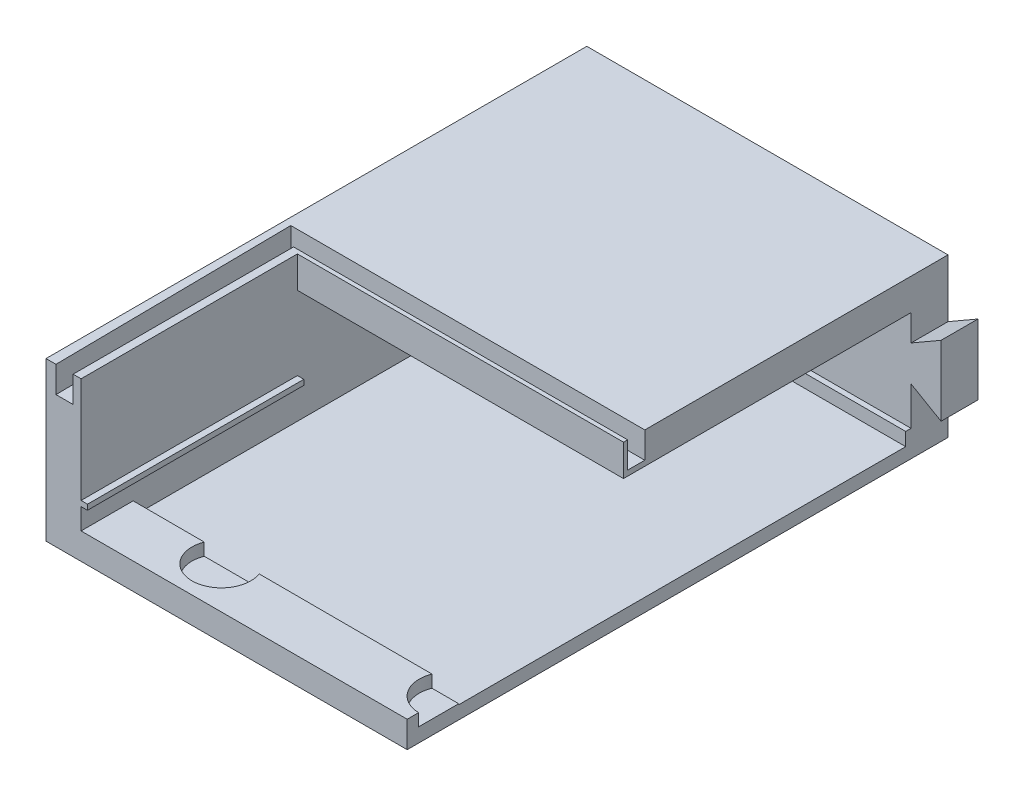
ISO-10303-21;
HEADER;
FILE_DESCRIPTION(('STEP AP214'),'2;1');
FILE_NAME('part.step','',(''),(''),'','','');
FILE_SCHEMA(('AUTOMOTIVE_DESIGN { 1 0 10303 214 1 1 1 1 }'));
ENDSEC;
DATA;
#1=APPLICATION_CONTEXT('core data for automotive mechanical design processes');
#2=APPLICATION_PROTOCOL_DEFINITION('international standard','automotive_design',2000,#1);
#3=PRODUCT_CONTEXT('',#1,'mechanical');
#4=PRODUCT('Part','Part','',(#3));
#5=PRODUCT_RELATED_PRODUCT_CATEGORY('part','',(#4));
#6=PRODUCT_DEFINITION_FORMATION('','',#4);
#7=PRODUCT_DEFINITION_CONTEXT('part definition',#1,'design');
#8=PRODUCT_DEFINITION('design','',#6,#7);
#9=PRODUCT_DEFINITION_SHAPE('','',#8);
#10=(LENGTH_UNIT() NAMED_UNIT(*) SI_UNIT(.MILLI.,.METRE.));
#11=(NAMED_UNIT(*) PLANE_ANGLE_UNIT() SI_UNIT($,.RADIAN.));
#12=(NAMED_UNIT(*) SI_UNIT($,.STERADIAN.) SOLID_ANGLE_UNIT());
#13=UNCERTAINTY_MEASURE_WITH_UNIT(LENGTH_MEASURE(1.E-05),#10,'distance_accuracy_value','');
#14=(GEOMETRIC_REPRESENTATION_CONTEXT(3) GLOBAL_UNCERTAINTY_ASSIGNED_CONTEXT((#13)) GLOBAL_UNIT_ASSIGNED_CONTEXT((#10,
#11,#12)) REPRESENTATION_CONTEXT('',''));
#15=CARTESIAN_POINT('',(0.,0.,0.));
#16=DIRECTION('',(0.,0.,1.));
#17=DIRECTION('',(1.,0.,0.));
#18=AXIS2_PLACEMENT_3D('',#15,#16,#17);
#19=CARTESIAN_POINT('',(142.996381437181,44.5862853397349,-115.01));
#20=DIRECTION('',(-0.5,0.866025403784439,0.));
#21=DIRECTION('',(-0.866025403784439,-0.5,0.));
#22=AXIS2_PLACEMENT_3D('',#19,#20,#21);
#23=PLANE('',#22);
#24=DIRECTION('',(0.866025403784439,0.5,0.));
#25=VECTOR('',#24,1.);
#26=CARTESIAN_POINT('',(38.4501752091939,-15.7734949687475,-115.));
#27=LINE('',#26,#25);
#28=CARTESIAN_POINT('',(131.625,38.0210152059206,-115.));
#29=VERTEX_POINT('',#28);
#30=CARTESIAN_POINT('',(142.996381437181,44.5862853397349,-115.));
#31=VERTEX_POINT('',#30);
#32=EDGE_CURVE('E446',#29,#31,#27,.T.);
#33=ORIENTED_EDGE('',*,*,#32,.F.);
#34=DIRECTION('',(0.,0.,1.));
#35=VECTOR('',#34,1.);
#36=CARTESIAN_POINT('',(131.625,38.0210152059206,-115.01));
#37=LINE('',#36,#35);
#38=CARTESIAN_POINT('',(131.625,38.0210152059206,-101.));
#39=VERTEX_POINT('',#38);
#40=EDGE_CURVE('E56',#29,#39,#37,.T.);
#41=ORIENTED_EDGE('',*,*,#40,.T.);
#42=DIRECTION('',(-0.866025403784439,-0.5,0.));
#43=VECTOR('',#42,1.);
#44=CARTESIAN_POINT('',(16.4426674769991,-28.4795354821229,-101.));
#45=LINE('',#44,#43);
#46=CARTESIAN_POINT('',(142.996381437181,44.5862853397349,-101.));
#47=VERTEX_POINT('',#46);
#48=EDGE_CURVE('E395',#47,#39,#45,.T.);
#49=ORIENTED_EDGE('',*,*,#48,.F.);
#50=DIRECTION('',(0.,0.,1.));
#51=VECTOR('',#50,1.);
#52=CARTESIAN_POINT('',(142.996381437181,44.5862853397349,-115.01));
#53=LINE('',#52,#51);
#54=EDGE_CURVE('E11',#31,#47,#53,.T.);
#55=ORIENTED_EDGE('',*,*,#54,.F.);
#56=EDGE_LOOP('',(#33,#41,#49,#55));
#57=FACE_BOUND('',#56,.T.);
#58=ADVANCED_FACE('F45',(#57),#23,.T.);
#59=CARTESIAN_POINT('',(131.625,59.9507551826827,-115.01));
#60=DIRECTION('',(1.,0.,0.));
#61=DIRECTION('',(0.,0.,-1.));
#62=AXIS2_PLACEMENT_3D('',#59,#60,#61);
#63=PLANE('',#62);
#64=DIRECTION('',(0.,-1.,0.));
#65=VECTOR('',#64,1.);
#66=CARTESIAN_POINT('',(131.625,60.,-115.));
#67=LINE('',#66,#65);
#68=CARTESIAN_POINT('',(131.625,59.9507551826827,-115.));
#69=VERTEX_POINT('',#68);
#70=EDGE_CURVE('E462',#69,#29,#67,.T.);
#71=ORIENTED_EDGE('',*,*,#70,.F.);
#72=DIRECTION('',(0.,0.,1.));
#73=VECTOR('',#72,1.);
#74=CARTESIAN_POINT('',(131.625,59.9507551826827,-115.01));
#75=LINE('',#74,#73);
#76=CARTESIAN_POINT('',(131.625,59.9507551826827,-0.0612445611802554));
#77=VERTEX_POINT('',#76);
#78=EDGE_CURVE('E264',#69,#77,#75,.T.);
#79=ORIENTED_EDGE('',*,*,#78,.T.);
#80=DIRECTION('',(0.,1.,0.));
#81=VECTOR('',#80,1.);
#82=CARTESIAN_POINT('',(131.625,50.,-0.0612445611802554));
#83=LINE('',#82,#81);
#84=CARTESIAN_POINT('',(131.625,50.,-0.0612445611802554));
#85=VERTEX_POINT('',#84);
#86=EDGE_CURVE('E436',#85,#77,#83,.T.);
#87=ORIENTED_EDGE('',*,*,#86,.F.);
#88=DIRECTION('',(0.,0.,-1.));
#89=VECTOR('',#88,1.);
#90=CARTESIAN_POINT('',(131.625,50.,0.));
#91=LINE('',#90,#89);
#92=CARTESIAN_POINT('',(131.625,50.,6.43875543881975));
#93=VERTEX_POINT('',#92);
#94=EDGE_CURVE('E423',#93,#85,#91,.T.);
#95=ORIENTED_EDGE('',*,*,#94,.F.);
#96=DIRECTION('',(0.,1.,0.));
#97=VECTOR('',#96,1.);
#98=CARTESIAN_POINT('',(131.625,50.,6.43875543881975));
#99=LINE('',#98,#97);
#100=CARTESIAN_POINT('',(131.625,59.9507551826827,6.43875543881975));
#101=VERTEX_POINT('',#100);
#102=EDGE_CURVE('E480',#93,#101,#99,.T.);
#103=ORIENTED_EDGE('',*,*,#102,.T.);
#104=CARTESIAN_POINT('',(131.625,59.9507551826827,8.));
#105=VERTEX_POINT('',#104);
#106=EDGE_CURVE('E273',#101,#105,#75,.T.);
#107=ORIENTED_EDGE('',*,*,#106,.T.);
#108=DIRECTION('',(0.,-1.,0.));
#109=VECTOR('',#108,1.);
#110=CARTESIAN_POINT('',(131.625,9.99999999999999,8.));
#111=LINE('',#110,#109);
#112=CARTESIAN_POINT('',(131.625,48.,8.));
#113=VERTEX_POINT('',#112);
#114=EDGE_CURVE('E261',#105,#113,#111,.T.);
#115=ORIENTED_EDGE('',*,*,#114,.T.);
#116=DIRECTION('',(0.,0.,-1.));
#117=VECTOR('',#116,1.);
#118=CARTESIAN_POINT('',(131.625,48.,-101.));
#119=LINE('',#118,#117);
#120=CARTESIAN_POINT('',(131.625,48.,-101.));
#121=VERTEX_POINT('',#120);
#122=EDGE_CURVE('E270',#113,#121,#119,.T.);
#123=ORIENTED_EDGE('',*,*,#122,.T.);
#124=DIRECTION('',(0.,1.,0.));
#125=VECTOR('',#124,1.);
#126=CARTESIAN_POINT('',(131.625,0.,-101.));
#127=LINE('',#126,#125);
#128=EDGE_CURVE('E412',#39,#121,#127,.T.);
#129=ORIENTED_EDGE('',*,*,#128,.F.);
#130=ORIENTED_EDGE('',*,*,#40,.F.);
#131=EDGE_LOOP('',(#71,#79,#87,#95,#103,#107,#115,#123,#129,#130));
#132=FACE_BOUND('',#131,.T.);
#133=ADVANCED_FACE('F268',(#132),#63,.T.);
#134=CARTESIAN_POINT('',(142.996381437181,44.5862853397349,-115.01));
#135=DIRECTION('',(1.,0.,0.));
#136=DIRECTION('',(0.,1.,0.));
#137=AXIS2_PLACEMENT_3D('',#134,#135,#136);
#138=PLANE('',#137);
#139=DIRECTION('',(0.,-1.,0.));
#140=VECTOR('',#139,1.);
#141=CARTESIAN_POINT('',(142.996381437181,59.9999999999994,-115.));
#142=LINE('',#141,#140);
#143=CARTESIAN_POINT('',(142.996381437181,18.0143801043625,-115.));
#144=VERTEX_POINT('',#143);
#145=EDGE_CURVE('E450',#31,#144,#142,.T.);
#146=ORIENTED_EDGE('',*,*,#145,.F.);
#147=ORIENTED_EDGE('',*,*,#54,.T.);
#148=DIRECTION('',(0.,1.,0.));
#149=VECTOR('',#148,1.);
#150=CARTESIAN_POINT('',(142.996381437181,-5.97465156161635E-13,-101.));
#151=LINE('',#150,#149);
#152=CARTESIAN_POINT('',(142.996381437181,18.0143801043625,-101.));
#153=VERTEX_POINT('',#152);
#154=EDGE_CURVE('E400',#153,#47,#151,.T.);
#155=ORIENTED_EDGE('',*,*,#154,.F.);
#156=DIRECTION('',(0.,0.,1.));
#157=VECTOR('',#156,1.);
#158=CARTESIAN_POINT('',(142.996381437181,18.0143801043625,-115.01));
#159=LINE('',#158,#157);
#160=EDGE_CURVE('E387',#144,#153,#159,.T.);
#161=ORIENTED_EDGE('',*,*,#160,.F.);
#162=EDGE_LOOP('',(#146,#147,#155,#161));
#163=FACE_BOUND('',#162,.T.);
#164=ADVANCED_FACE('F624',(#163),#138,.T.);
#165=CARTESIAN_POINT('',(142.996381437181,18.0143801043625,-115.01));
#166=DIRECTION('',(-0.500000000000004,-0.866025403784436,0.));
#167=DIRECTION('',(0.866025403784436,-0.500000000000004,0.));
#168=AXIS2_PLACEMENT_3D('',#165,#166,#167);
#169=PLANE('',#168);
#170=DIRECTION('',(-0.866025403784436,0.500000000000004,0.));
#171=VECTOR('',#170,1.);
#172=CARTESIAN_POINT('',(13.5955342663276,92.7239940518211,-115.));
#173=LINE('',#172,#171);
#174=CARTESIAN_POINT('',(131.625,24.5796502381769,-115.));
#175=VERTEX_POINT('',#174);
#176=EDGE_CURVE('E454',#144,#175,#173,.T.);
#177=ORIENTED_EDGE('',*,*,#176,.F.);
#178=ORIENTED_EDGE('',*,*,#160,.T.);
#179=DIRECTION('',(0.866025403784436,-0.500000000000004,0.));
#180=VECTOR('',#179,1.);
#181=CARTESIAN_POINT('',(43.5495507611993,75.4300345651962,-101.));
#182=LINE('',#181,#180);
#183=CARTESIAN_POINT('',(131.625,24.5796502381769,-101.));
#184=VERTEX_POINT('',#183);
#185=EDGE_CURVE('E404',#184,#153,#182,.T.);
#186=ORIENTED_EDGE('',*,*,#185,.F.);
#187=DIRECTION('',(0.,0.,1.));
#188=VECTOR('',#187,1.);
#189=CARTESIAN_POINT('',(131.625,24.5796502381769,-115.01));
#190=LINE('',#189,#188);
#191=EDGE_CURVE('E390',#175,#184,#190,.T.);
#192=ORIENTED_EDGE('',*,*,#191,.F.);
#193=EDGE_LOOP('',(#177,#178,#186,#192));
#194=FACE_BOUND('',#193,.T.);
#195=ADVANCED_FACE('F621',(#194),#169,.T.);
#196=CARTESIAN_POINT('',(131.625,24.5796502381769,-115.01));
#197=DIRECTION('',(1.,0.,0.));
#198=DIRECTION('',(0.,1.,0.));
#199=AXIS2_PLACEMENT_3D('',#196,#197,#198);
#200=PLANE('',#199);
#201=DIRECTION('',(0.,-1.,0.));
#202=VECTOR('',#201,1.);
#203=CARTESIAN_POINT('',(131.625,60.0000000000009,-115.));
#204=LINE('',#203,#202);
#205=CARTESIAN_POINT('',(131.625,0.,-115.));
#206=VERTEX_POINT('',#205);
#207=EDGE_CURVE('E458',#175,#206,#204,.T.);
#208=ORIENTED_EDGE('',*,*,#207,.F.);
#209=ORIENTED_EDGE('',*,*,#191,.T.);
#210=DIRECTION('',(0.,1.,0.));
#211=VECTOR('',#210,1.);
#212=CARTESIAN_POINT('',(131.625,8.89824651190616E-13,-101.));
#213=LINE('',#212,#211);
#214=CARTESIAN_POINT('',(131.625,9.99999999999999,-101.));
#215=VERTEX_POINT('',#214);
#216=EDGE_CURVE('E408',#215,#184,#213,.T.);
#217=ORIENTED_EDGE('',*,*,#216,.F.);
#218=DIRECTION('',(0.,0.,1.));
#219=VECTOR('',#218,1.);
#220=CARTESIAN_POINT('',(131.625,9.99999999999999,-101.));
#221=LINE('',#220,#219);
#222=CARTESIAN_POINT('',(131.625,9.99999999999999,-98.9628021729257));
#223=VERTEX_POINT('',#222);
#224=EDGE_CURVE('E282',#215,#223,#221,.T.);
#225=ORIENTED_EDGE('',*,*,#224,.T.);
#226=DIRECTION('',(0.,-1.,0.));
#227=VECTOR('',#226,1.);
#228=CARTESIAN_POINT('',(131.625,5.00000000000083,-98.9628021729257));
#229=LINE('',#228,#227);
#230=CARTESIAN_POINT('',(131.625,4.99999999999999,-98.9628021729257));
#231=VERTEX_POINT('',#230);
#232=EDGE_CURVE('E499',#223,#231,#229,.T.);
#233=ORIENTED_EDGE('',*,*,#232,.T.);
#234=DIRECTION('',(0.,0.,1.));
#235=VECTOR('',#234,1.);
#236=CARTESIAN_POINT('',(131.625,4.99999999999999,0.));
#237=LINE('',#236,#235);
#238=CARTESIAN_POINT('',(131.625,4.99999999999999,70.4851481283429));
#239=VERTEX_POINT('',#238);
#240=EDGE_CURVE('E286',#231,#239,#237,.T.);
#241=ORIENTED_EDGE('',*,*,#240,.T.);
#242=DIRECTION('',(0.,1.,0.));
#243=VECTOR('',#242,1.);
#244=CARTESIAN_POINT('',(131.625,5.00000000000083,70.4851481283429));
#245=LINE('',#244,#243);
#246=CARTESIAN_POINT('',(131.625,5.33999999999999,70.485148128343));
#247=VERTEX_POINT('',#246);
#248=EDGE_CURVE('E495',#239,#247,#245,.T.);
#249=ORIENTED_EDGE('',*,*,#248,.T.);
#250=DIRECTION('',(0.,0.,-1.));
#251=VECTOR('',#250,1.);
#252=CARTESIAN_POINT('',(131.625,5.33999999999999,74.522104321755));
#253=LINE('',#252,#251);
#254=CARTESIAN_POINT('',(131.625,5.33999999999999,85.6696744542363));
#255=VERTEX_POINT('',#254);
#256=EDGE_CURVE('E415',#255,#247,#253,.T.);
#257=ORIENTED_EDGE('',*,*,#256,.F.);
#258=DIRECTION('',(0.,1.,0.));
#259=VECTOR('',#258,1.);
#260=CARTESIAN_POINT('',(131.625,5.33999999999999,85.6696744542363));
#261=LINE('',#260,#259);
#262=CARTESIAN_POINT('',(131.625,9.99999999999999,85.6696744542363));
#263=VERTEX_POINT('',#262);
#264=EDGE_CURVE('E491',#255,#263,#261,.T.);
#265=ORIENTED_EDGE('',*,*,#264,.T.);
#266=DIRECTION('',(0.,0.,-1.));
#267=VECTOR('',#266,1.);
#268=CARTESIAN_POINT('',(131.625,9.99999999999999,0.));
#269=LINE('',#268,#267);
#270=CARTESIAN_POINT('',(131.625,9.99999999999999,90.));
#271=VERTEX_POINT('',#270);
#272=EDGE_CURVE('E419',#271,#263,#269,.T.);
#273=ORIENTED_EDGE('',*,*,#272,.F.);
#274=DIRECTION('',(0.,1.,0.));
#275=VECTOR('',#274,1.);
#276=CARTESIAN_POINT('',(131.625,60.0000000000009,90.));
#277=LINE('',#276,#275);
#278=CARTESIAN_POINT('',(131.625,0.,90.));
#279=VERTEX_POINT('',#278);
#280=EDGE_CURVE('E470',#279,#271,#277,.T.);
#281=ORIENTED_EDGE('',*,*,#280,.F.);
#282=DIRECTION('',(0.,0.,1.));
#283=VECTOR('',#282,1.);
#284=CARTESIAN_POINT('',(131.625,0.,0.));
#285=LINE('',#284,#283);
#286=EDGE_CURVE('E440',#206,#279,#285,.T.);
#287=ORIENTED_EDGE('',*,*,#286,.F.);
#288=EDGE_LOOP('',(#208,#209,#217,#225,#233,#241,#249,#257,#265,#273,#281,#287));
#289=FACE_BOUND('',#288,.T.);
#290=ADVANCED_FACE('F507',(#289),#200,.T.);
#291=CARTESIAN_POINT('',(-5.37757913761476,59.9507551826827,-115.01));
#292=DIRECTION('',(0.,1.,0.));
#293=DIRECTION('',(0.,0.,1.));
#294=AXIS2_PLACEMENT_3D('',#291,#292,#293);
#295=PLANE('',#294);
#296=DIRECTION('',(1.,0.,0.));
#297=VECTOR('',#296,1.);
#298=CARTESIAN_POINT('',(-5.2976725084512,59.9507551826827,-115.));
#299=LINE('',#298,#297);
#300=CARTESIAN_POINT('',(-5.2976725084512,59.9507551826827,-115.));
#301=VERTEX_POINT('',#300);
#302=EDGE_CURVE('E466',#301,#69,#299,.T.);
#303=ORIENTED_EDGE('',*,*,#302,.F.);
#304=DIRECTION('',(0.,0.,-1.));
#305=VECTOR('',#304,1.);
#306=CARTESIAN_POINT('',(-5.2976725084512,59.9507551826827,90.));
#307=LINE('',#306,#305);
#308=CARTESIAN_POINT('',(-5.2976725084512,59.9507551826827,90.));
#309=VERTEX_POINT('',#308);
#310=EDGE_CURVE('E443',#309,#301,#307,.T.);
#311=ORIENTED_EDGE('',*,*,#310,.F.);
#312=DIRECTION('',(-1.,0.,0.));
#313=VECTOR('',#312,1.);
#314=CARTESIAN_POINT('',(0.,59.9507551826827,90.));
#315=LINE('',#314,#313);
#316=CARTESIAN_POINT('',(-1.5186079351983,59.9507551826827,90.000001141251));
#317=VERTEX_POINT('',#316);
#318=EDGE_CURVE('E474',#317,#309,#315,.T.);
#319=ORIENTED_EDGE('',*,*,#318,.F.);
#320=DIRECTION('',(0.011649326560156,0.,0.999932144293149));
#321=VECTOR('',#320,1.);
#322=CARTESIAN_POINT('',(-1.5186079351983,59.9507551826827,90.000001141251));
#323=LINE('',#322,#321);
#324=CARTESIAN_POINT('',(-2.56783199264043,59.9507551826827,-0.0612445611802538));
#325=VERTEX_POINT('',#324);
#326=EDGE_CURVE('E426',#325,#317,#323,.T.);
#327=ORIENTED_EDGE('',*,*,#326,.F.);
#328=DIRECTION('',(-1.,0.,0.));
#329=VECTOR('',#328,1.);
#330=CARTESIAN_POINT('',(-2.56783199264043,59.9507551826827,-0.0612445611802538));
#331=LINE('',#330,#329);
#332=EDGE_CURVE('E432',#77,#325,#331,.T.);
#333=ORIENTED_EDGE('',*,*,#332,.F.);
#334=ORIENTED_EDGE('',*,*,#78,.F.);
#335=EDGE_LOOP('',(#303,#311,#319,#327,#333,#334));
#336=FACE_BOUND('',#335,.T.);
#337=ADVANCED_FACE('F632',(#336),#295,.T.);
#338=ORIENTED_EDGE('',*,*,#106,.F.);
#339=DIRECTION('',(-1.,0.,0.));
#340=VECTOR('',#339,1.);
#341=CARTESIAN_POINT('',(4.98139206480159,59.9507551826827,6.43875543881975));
#342=LINE('',#341,#340);
#343=CARTESIAN_POINT('',(4.98139206480159,59.9507551826827,6.43875543881975));
#344=VERTEX_POINT('',#343);
#345=EDGE_CURVE('E483',#101,#344,#342,.T.);
#346=ORIENTED_EDGE('',*,*,#345,.T.);
#347=DIRECTION('',(0.,0.,-1.));
#348=VECTOR('',#347,1.);
#349=CARTESIAN_POINT('',(4.98139206480159,59.9507551826827,6.43875543881975));
#350=LINE('',#349,#348);
#351=CARTESIAN_POINT('',(4.9813920648016,59.9507551826827,90.));
#352=VERTEX_POINT('',#351);
#353=EDGE_CURVE('E429',#352,#344,#350,.T.);
#354=ORIENTED_EDGE('',*,*,#353,.F.);
#355=CARTESIAN_POINT('',(8.00000000000001,59.9507551826827,90.));
#356=VERTEX_POINT('',#355);
#357=EDGE_CURVE('E276',#356,#352,#315,.T.);
#358=ORIENTED_EDGE('',*,*,#357,.F.);
#359=DIRECTION('',(0.,0.,-1.));
#360=VECTOR('',#359,1.);
#361=CARTESIAN_POINT('',(8.,59.9507551826827,8.));
#362=LINE('',#361,#360);
#363=CARTESIAN_POINT('',(8.,59.9507551826827,8.));
#364=VERTEX_POINT('',#363);
#365=EDGE_CURVE('E487',#356,#364,#362,.T.);
#366=ORIENTED_EDGE('',*,*,#365,.T.);
#367=DIRECTION('',(1.,0.,0.));
#368=VECTOR('',#367,1.);
#369=CARTESIAN_POINT('',(255.25,59.9507551826827,8.));
#370=LINE('',#369,#368);
#371=EDGE_CURVE('E277',#364,#105,#370,.T.);
#372=ORIENTED_EDGE('',*,*,#371,.T.);
#373=EDGE_LOOP('',(#338,#346,#354,#358,#366,#372));
#374=FACE_BOUND('',#373,.T.);
#375=ADVANCED_FACE('F652',(#374),#295,.T.);
#376=CARTESIAN_POINT('',(10.4282385352864,20.,4.99999999999999));
#377=DIRECTION('',(1.,0.,0.));
#378=DIRECTION('',(0.,0.,-1.));
#379=AXIS2_PLACEMENT_3D('',#376,#377,#378);
#380=PLANE('',#379);
#381=DIRECTION('',(0.,-1.,0.));
#382=VECTOR('',#381,1.);
#383=CARTESIAN_POINT('',(10.4282385352864,9.99999999999999,8.));
#384=LINE('',#383,#382);
#385=CARTESIAN_POINT('',(10.4282385352864,20.,8.));
#386=VERTEX_POINT('',#385);
#387=CARTESIAN_POINT('',(10.4282385352864,18.,8.));
#388=VERTEX_POINT('',#387);
#389=EDGE_CURVE('E399',#386,#388,#384,.T.);
#390=ORIENTED_EDGE('',*,*,#389,.F.);
#391=DIRECTION('',(0.,0.,1.));
#392=VECTOR('',#391,1.);
#393=CARTESIAN_POINT('',(10.4282385352864,20.,4.99999999999999));
#394=LINE('',#393,#392);
#395=CARTESIAN_POINT('',(10.4282385352864,20.,90.));
#396=VERTEX_POINT('',#395);
#397=EDGE_CURVE('E591',#386,#396,#394,.T.);
#398=ORIENTED_EDGE('',*,*,#397,.T.);
#399=DIRECTION('',(0.,1.,0.));
#400=VECTOR('',#399,1.);
#401=CARTESIAN_POINT('',(10.4282385352864,20.,90.));
#402=LINE('',#401,#400);
#403=CARTESIAN_POINT('',(10.4282385352864,18.,90.));
#404=VERTEX_POINT('',#403);
#405=EDGE_CURVE('E600',#404,#396,#402,.T.);
#406=ORIENTED_EDGE('',*,*,#405,.F.);
#407=DIRECTION('',(0.,0.,1.));
#408=VECTOR('',#407,1.);
#409=CARTESIAN_POINT('',(10.4282385352864,18.,4.99999999999999));
#410=LINE('',#409,#408);
#411=EDGE_CURVE('E592',#388,#404,#410,.T.);
#412=ORIENTED_EDGE('',*,*,#411,.F.);
#413=EDGE_LOOP('',(#390,#398,#406,#412));
#414=FACE_BOUND('',#413,.T.);
#415=ADVANCED_FACE('F677',(#414),#380,.T.);
#416=CARTESIAN_POINT('',(-5.2976725084512,60.,90.));
#417=DIRECTION('',(-1.,0.,0.));
#418=DIRECTION('',(0.,0.,1.));
#419=AXIS2_PLACEMENT_3D('',#416,#417,#418);
#420=PLANE('',#419);
#421=DIRECTION('',(0.,-1.,0.));
#422=VECTOR('',#421,1.);
#423=CARTESIAN_POINT('',(-5.2976725084512,60.,90.));
#424=LINE('',#423,#422);
#425=CARTESIAN_POINT('',(-5.2976725084512,0.,90.));
#426=VERTEX_POINT('',#425);
#427=EDGE_CURVE('E293',#309,#426,#424,.T.);
#428=ORIENTED_EDGE('',*,*,#427,.F.);
#429=ORIENTED_EDGE('',*,*,#310,.T.);
#430=DIRECTION('',(0.,-1.,0.));
#431=VECTOR('',#430,1.);
#432=CARTESIAN_POINT('',(-5.2976725084512,60.,-115.));
#433=LINE('',#432,#431);
#434=CARTESIAN_POINT('',(-5.2976725084512,0.,-115.));
#435=VERTEX_POINT('',#434);
#436=EDGE_CURVE('E290',#301,#435,#433,.T.);
#437=ORIENTED_EDGE('',*,*,#436,.T.);
#438=DIRECTION('',(0.,0.,-1.));
#439=VECTOR('',#438,1.);
#440=CARTESIAN_POINT('',(-5.2976725084512,0.,90.));
#441=LINE('',#440,#439);
#442=EDGE_CURVE('E301',#426,#435,#441,.T.);
#443=ORIENTED_EDGE('',*,*,#442,.F.);
#444=EDGE_LOOP('',(#428,#429,#437,#443));
#445=FACE_BOUND('',#444,.T.);
#446=ADVANCED_FACE('F541',(#445),#420,.T.);
#447=CARTESIAN_POINT('',(4.98139206480159,50.,6.43875543881975));
#448=DIRECTION('',(-1.,0.,0.));
#449=DIRECTION('',(0.,0.,1.));
#450=AXIS2_PLACEMENT_3D('',#447,#448,#449);
#451=PLANE('',#450);
#452=DIRECTION('',(0.,1.,0.));
#453=VECTOR('',#452,1.);
#454=CARTESIAN_POINT('',(4.9813920648016,50.,90.));
#455=LINE('',#454,#453);
#456=CARTESIAN_POINT('',(4.9813920648016,50.,90.));
#457=VERTEX_POINT('',#456);
#458=EDGE_CURVE('E310',#457,#352,#455,.T.);
#459=ORIENTED_EDGE('',*,*,#458,.T.);
#460=ORIENTED_EDGE('',*,*,#353,.T.);
#461=DIRECTION('',(0.,1.,0.));
#462=VECTOR('',#461,1.);
#463=CARTESIAN_POINT('',(4.98139206480159,50.,6.43875543881975));
#464=LINE('',#463,#462);
#465=CARTESIAN_POINT('',(4.98139206480159,50.,6.43875543881975));
#466=VERTEX_POINT('',#465);
#467=EDGE_CURVE('E306',#466,#344,#464,.T.);
#468=ORIENTED_EDGE('',*,*,#467,.F.);
#469=DIRECTION('',(0.,0.,1.));
#470=VECTOR('',#469,1.);
#471=CARTESIAN_POINT('',(4.98139206480159,50.,6.43875543881975));
#472=LINE('',#471,#470);
#473=EDGE_CURVE('E328',#466,#457,#472,.T.);
#474=ORIENTED_EDGE('',*,*,#473,.T.);
#475=EDGE_LOOP('',(#459,#460,#468,#474));
#476=FACE_BOUND('',#475,.T.);
#477=ADVANCED_FACE('F685',(#476),#451,.T.);
#478=CARTESIAN_POINT('',(10.4282385352864,18.,4.99999999999999));
#479=DIRECTION('',(0.,-1.,0.));
#480=DIRECTION('',(0.,0.,-1.));
#481=AXIS2_PLACEMENT_3D('',#478,#479,#480);
#482=PLANE('',#481);
#483=DIRECTION('',(-1.,0.,0.));
#484=VECTOR('',#483,1.);
#485=CARTESIAN_POINT('',(255.25,18.,8.));
#486=LINE('',#485,#484);
#487=CARTESIAN_POINT('',(8.00000000000001,18.,8.));
#488=VERTEX_POINT('',#487);
#489=EDGE_CURVE('E88',#388,#488,#486,.T.);
#490=ORIENTED_EDGE('',*,*,#489,.F.);
#491=ORIENTED_EDGE('',*,*,#411,.T.);
#492=DIRECTION('',(1.,0.,0.));
#493=VECTOR('',#492,1.);
#494=CARTESIAN_POINT('',(10.4282385352864,18.,90.));
#495=LINE('',#494,#493);
#496=CARTESIAN_POINT('',(7.99999999999999,18.,90.));
#497=VERTEX_POINT('',#496);
#498=EDGE_CURVE('E604',#497,#404,#495,.T.);
#499=ORIENTED_EDGE('',*,*,#498,.F.);
#500=DIRECTION('',(0.,0.,1.));
#501=VECTOR('',#500,1.);
#502=CARTESIAN_POINT('',(8.,18.,8.));
#503=LINE('',#502,#501);
#504=EDGE_CURVE('E294',#488,#497,#503,.T.);
#505=ORIENTED_EDGE('',*,*,#504,.F.);
#506=EDGE_LOOP('',(#490,#491,#499,#505));
#507=FACE_BOUND('',#506,.T.);
#508=ADVANCED_FACE('F691',(#507),#482,.T.);
#509=CARTESIAN_POINT('',(0.,0.,8.));
#510=DIRECTION('',(0.,0.,1.));
#511=DIRECTION('',(1.,0.,0.));
#512=AXIS2_PLACEMENT_3D('',#509,#510,#511);
#513=PLANE('',#512);
#514=DIRECTION('',(1.,0.,0.));
#515=VECTOR('',#514,1.);
#516=CARTESIAN_POINT('',(255.25,20.,8.));
#517=LINE('',#516,#515);
#518=CARTESIAN_POINT('',(8.00000000000001,20.,8.));
#519=VERTEX_POINT('',#518);
#520=EDGE_CURVE('E586',#519,#386,#517,.T.);
#521=ORIENTED_EDGE('',*,*,#520,.T.);
#522=ORIENTED_EDGE('',*,*,#389,.T.);
#523=ORIENTED_EDGE('',*,*,#489,.T.);
#524=DIRECTION('',(0.,-1.,0.));
#525=VECTOR('',#524,1.);
#526=CARTESIAN_POINT('',(8.00000000000001,48.,8.));
#527=LINE('',#526,#525);
#528=EDGE_CURVE('E83',#519,#488,#527,.T.);
#529=ORIENTED_EDGE('',*,*,#528,.F.);
#530=EDGE_LOOP('',(#521,#522,#523,#529));
#531=FACE_BOUND('',#530,.T.);
#532=ADVANCED_FACE('F695',(#531),#513,.F.);
#533=CARTESIAN_POINT('',(7.99999999999999,20.,4.99999999999999));
#534=DIRECTION('',(0.,1.,0.));
#535=DIRECTION('',(0.,0.,1.));
#536=AXIS2_PLACEMENT_3D('',#533,#534,#535);
#537=PLANE('',#536);
#538=ORIENTED_EDGE('',*,*,#520,.F.);
#539=DIRECTION('',(0.,0.,-1.));
#540=VECTOR('',#539,1.);
#541=CARTESIAN_POINT('',(8.,20.,8.));
#542=LINE('',#541,#540);
#543=CARTESIAN_POINT('',(8.00000000000001,20.,90.));
#544=VERTEX_POINT('',#543);
#545=EDGE_CURVE('E658',#544,#519,#542,.T.);
#546=ORIENTED_EDGE('',*,*,#545,.F.);
#547=DIRECTION('',(-1.,0.,0.));
#548=VECTOR('',#547,1.);
#549=CARTESIAN_POINT('',(7.99999999999999,20.,90.));
#550=LINE('',#549,#548);
#551=EDGE_CURVE('E595',#396,#544,#550,.T.);
#552=ORIENTED_EDGE('',*,*,#551,.F.);
#553=ORIENTED_EDGE('',*,*,#397,.F.);
#554=EDGE_LOOP('',(#538,#546,#552,#553));
#555=FACE_BOUND('',#554,.T.);
#556=ADVANCED_FACE('F692',(#555),#537,.T.);
#557=CARTESIAN_POINT('',(0.,60.,90.));
#558=DIRECTION('',(0.,0.,1.));
#559=DIRECTION('',(1.,0.,0.));
#560=AXIS2_PLACEMENT_3D('',#557,#558,#559);
#561=PLANE('',#560);
#562=DIRECTION('',(0.,1.,0.));
#563=VECTOR('',#562,1.);
#564=CARTESIAN_POINT('',(8.00000000000001,9.99999999999999,90.));
#565=LINE('',#564,#563);
#566=EDGE_CURVE('E336',#544,#356,#565,.T.);
#567=ORIENTED_EDGE('',*,*,#566,.T.);
#568=ORIENTED_EDGE('',*,*,#357,.T.);
#569=ORIENTED_EDGE('',*,*,#458,.F.);
#570=DIRECTION('',(0.999999999999985,0.,-1.75577074247057E-07));
#571=VECTOR('',#570,1.);
#572=CARTESIAN_POINT('',(-1.5186079351983,50.,90.000001141251));
#573=LINE('',#572,#571);
#574=CARTESIAN_POINT('',(-1.5186079351983,50.,90.000001141251));
#575=VERTEX_POINT('',#574);
#576=EDGE_CURVE('E551',#575,#457,#573,.T.);
#577=ORIENTED_EDGE('',*,*,#576,.F.);
#578=DIRECTION('',(0.,1.,0.));
#579=VECTOR('',#578,1.);
#580=CARTESIAN_POINT('',(-1.5186079351983,50.,90.000001141251));
#581=LINE('',#580,#579);
#582=EDGE_CURVE('E314',#575,#317,#581,.T.);
#583=ORIENTED_EDGE('',*,*,#582,.T.);
#584=ORIENTED_EDGE('',*,*,#318,.T.);
#585=ORIENTED_EDGE('',*,*,#427,.T.);
#586=DIRECTION('',(-1.,0.,0.));
#587=VECTOR('',#586,1.);
#588=CARTESIAN_POINT('',(0.,0.,90.));
#589=LINE('',#588,#587);
#590=EDGE_CURVE('E302',#279,#426,#589,.T.);
#591=ORIENTED_EDGE('',*,*,#590,.F.);
#592=ORIENTED_EDGE('',*,*,#280,.T.);
#593=DIRECTION('',(1.,0.,0.));
#594=VECTOR('',#593,1.);
#595=CARTESIAN_POINT('',(8.00000000000001,9.99999999999999,90.));
#596=LINE('',#595,#594);
#597=CARTESIAN_POINT('',(8.00000000000001,9.99999999999999,90.));
#598=VERTEX_POINT('',#597);
#599=EDGE_CURVE('E339',#598,#271,#596,.T.);
#600=ORIENTED_EDGE('',*,*,#599,.F.);
#601=EDGE_CURVE('E332',#598,#497,#565,.T.);
#602=ORIENTED_EDGE('',*,*,#601,.T.);
#603=ORIENTED_EDGE('',*,*,#498,.T.);
#604=ORIENTED_EDGE('',*,*,#405,.T.);
#605=ORIENTED_EDGE('',*,*,#551,.T.);
#606=EDGE_LOOP('',(#567,#568,#569,#577,#583,#584,#585,#591,#592,#600,#602,#603,#604,#605));
#607=FACE_BOUND('',#606,.T.);
#608=ADVANCED_FACE('F534',(#607),#561,.T.);
#609=CARTESIAN_POINT('',(131.857766280656,5.33999999999999,74.522104321755));
#610=DIRECTION('',(0.,1.,0.));
#611=DIRECTION('',(0.,0.,1.));
#612=AXIS2_PLACEMENT_3D('',#609,#610,#611);
#613=PLANE('',#612);
#614=CARTESIAN_POINT('',(131.857766280656,5.33999999999999,74.522104321755));
#615=DIRECTION('',(0.,1.,0.));
#616=DIRECTION('',(0.,0.,1.));
#617=AXIS2_PLACEMENT_3D('',#614,#615,#616);
#618=CIRCLE('',#617,11.15);
#619=CARTESIAN_POINT('',(121.471660690305,5.33999999999999,70.4660827899976));
#620=VERTEX_POINT('',#619);
#621=EDGE_CURVE('E344',#620,#255,#618,.T.);
#622=ORIENTED_EDGE('',*,*,#621,.T.);
#623=ORIENTED_EDGE('',*,*,#256,.T.);
#624=DIRECTION('',(0.999998237049616,0.,0.00187773737807381));
#625=VECTOR('',#624,1.);
#626=CARTESIAN_POINT('',(131.86534579012,5.33999999999999,70.4855994354124));
#627=LINE('',#626,#625);
#628=EDGE_CURVE('E352',#620,#247,#627,.T.);
#629=ORIENTED_EDGE('',*,*,#628,.F.);
#630=EDGE_LOOP('',(#622,#623,#629));
#631=FACE_BOUND('',#630,.T.);
#632=ADVANCED_FACE('F522',(#631),#613,.T.);
#633=CARTESIAN_POINT('',(131.857766280656,5.33999999999999,74.522104321755));
#634=DIRECTION('',(0.,1.,0.));
#635=DIRECTION('',(0.,0.,1.));
#636=AXIS2_PLACEMENT_3D('',#633,#634,#635);
#637=CYLINDRICAL_SURFACE('',#636,11.15);
#638=ORIENTED_EDGE('',*,*,#264,.F.);
#639=ORIENTED_EDGE('',*,*,#621,.F.);
#640=DIRECTION('',(0.,1.,0.));
#641=VECTOR('',#640,1.);
#642=CARTESIAN_POINT('',(121.471660690305,5.33999999999999,70.4660827899976));
#643=LINE('',#642,#641);
#644=CARTESIAN_POINT('',(121.471660690305,9.99999999999999,70.4660827899976));
#645=VERTEX_POINT('',#644);
#646=EDGE_CURVE('E356',#620,#645,#643,.T.);
#647=ORIENTED_EDGE('',*,*,#646,.T.);
#648=CARTESIAN_POINT('',(131.857766280656,9.99999999999999,74.522104321755));
#649=DIRECTION('',(0.,1.,0.));
#650=DIRECTION('',(0.,0.,1.));
#651=AXIS2_PLACEMENT_3D('',#648,#649,#650);
#652=CIRCLE('',#651,11.15);
#653=EDGE_CURVE('E348',#645,#263,#652,.T.);
#654=ORIENTED_EDGE('',*,*,#653,.T.);
#655=EDGE_LOOP('',(#638,#639,#647,#654));
#656=FACE_BOUND('',#655,.T.);
#657=ADVANCED_FACE('F525',(#656),#637,.F.);
#658=CARTESIAN_POINT('',(45.4096313441434,5.33999999999999,74.2249257103475));
#659=DIRECTION('',(0.,1.,0.));
#660=DIRECTION('',(0.,0.,1.));
#661=AXIS2_PLACEMENT_3D('',#658,#659,#660);
#662=PLANE('',#661);
#663=DIRECTION('',(0.999998237049616,0.,0.00187773737807381));
#664=VECTOR('',#663,1.);
#665=CARTESIAN_POINT('',(45.4169576384815,5.33999999999999,70.3232717795302));
#666=LINE('',#665,#664);
#667=CARTESIAN_POINT('',(34.9719033899041,5.33999999999999,70.3036586761747));
#668=VERTEX_POINT('',#667);
#669=CARTESIAN_POINT('',(55.8620118870589,5.33999999999999,70.3428848828857));
#670=VERTEX_POINT('',#669);
#671=EDGE_CURVE('E575',#668,#670,#666,.T.);
#672=ORIENTED_EDGE('',*,*,#671,.F.);
#673=CARTESIAN_POINT('',(45.4096313441434,5.33999999999999,74.2249257103475));
#674=DIRECTION('',(0.,1.,0.));
#675=DIRECTION('',(0.,0.,1.));
#676=AXIS2_PLACEMENT_3D('',#673,#674,#675);
#677=CIRCLE('',#676,11.15);
#678=EDGE_CURVE('E559',#668,#670,#677,.T.);
#679=ORIENTED_EDGE('',*,*,#678,.T.);
#680=EDGE_LOOP('',(#672,#679));
#681=FACE_BOUND('',#680,.T.);
#682=ADVANCED_FACE('F668',(#681),#662,.T.);
#683=CARTESIAN_POINT('',(45.4096313441434,5.33999999999999,74.2249257103475));
#684=DIRECTION('',(0.,1.,0.));
#685=DIRECTION('',(0.,0.,1.));
#686=AXIS2_PLACEMENT_3D('',#683,#684,#685);
#687=CYLINDRICAL_SURFACE('',#686,11.15);
#688=CARTESIAN_POINT('',(45.4096313441434,9.99999999999999,74.2249257103475));
#689=DIRECTION('',(0.,1.,0.));
#690=DIRECTION('',(0.,0.,1.));
#691=AXIS2_PLACEMENT_3D('',#688,#689,#690);
#692=CIRCLE('',#691,11.15);
#693=CARTESIAN_POINT('',(34.9719033899041,9.99999999999999,70.3036586761747));
#694=VERTEX_POINT('',#693);
#695=CARTESIAN_POINT('',(55.8620118870589,9.99999999999999,70.3428848828857));
#696=VERTEX_POINT('',#695);
#697=EDGE_CURVE('E351',#694,#696,#692,.T.);
#698=ORIENTED_EDGE('',*,*,#697,.T.);
#699=DIRECTION('',(0.,1.,0.));
#700=VECTOR('',#699,1.);
#701=CARTESIAN_POINT('',(55.8620118870589,5.33999999999999,70.3428848828857));
#702=LINE('',#701,#700);
#703=EDGE_CURVE('E355',#696,#670,#702,.F.);
#704=ORIENTED_EDGE('',*,*,#703,.T.);
#705=ORIENTED_EDGE('',*,*,#678,.F.);
#706=DIRECTION('',(0.,1.,0.));
#707=VECTOR('',#706,1.);
#708=CARTESIAN_POINT('',(34.9719033899041,5.33999999999999,70.3036586761747));
#709=LINE('',#708,#707);
#710=EDGE_CURVE('E571',#668,#694,#709,.T.);
#711=ORIENTED_EDGE('',*,*,#710,.T.);
#712=EDGE_LOOP('',(#698,#704,#705,#711));
#713=FACE_BOUND('',#712,.T.);
#714=ADVANCED_FACE('F664',(#713),#687,.F.);
#715=CARTESIAN_POINT('',(0.,9.99999999999999,0.));
#716=DIRECTION('',(0.,1.,0.));
#717=DIRECTION('',(0.,0.,1.));
#718=AXIS2_PLACEMENT_3D('',#715,#716,#717);
#719=PLANE('',#718);
#720=ORIENTED_EDGE('',*,*,#599,.T.);
#721=ORIENTED_EDGE('',*,*,#272,.T.);
#722=ORIENTED_EDGE('',*,*,#653,.F.);
#723=DIRECTION('',(0.999998237049615,0.,0.00187773737807381));
#724=VECTOR('',#723,1.);
#725=CARTESIAN_POINT('',(8.,9.99999999999999,70.2530124357349));
#726=LINE('',#725,#724);
#727=EDGE_CURVE('E370',#696,#645,#726,.T.);
#728=ORIENTED_EDGE('',*,*,#727,.F.);
#729=ORIENTED_EDGE('',*,*,#697,.F.);
#730=CARTESIAN_POINT('',(8.,9.99999999999999,70.2530124357349));
#731=VERTEX_POINT('',#730);
#732=EDGE_CURVE('E367',#731,#694,#726,.T.);
#733=ORIENTED_EDGE('',*,*,#732,.F.);
#734=DIRECTION('',(0.,0.,1.));
#735=VECTOR('',#734,1.);
#736=CARTESIAN_POINT('',(8.,9.99999999999999,8.));
#737=LINE('',#736,#735);
#738=EDGE_CURVE('E343',#731,#598,#737,.T.);
#739=ORIENTED_EDGE('',*,*,#738,.T.);
#740=EDGE_LOOP('',(#720,#721,#722,#728,#729,#733,#739));
#741=FACE_BOUND('',#740,.T.);
#742=ADVANCED_FACE('F529',(#741),#719,.T.);
#743=CARTESIAN_POINT('',(8.,4.99999999999999,70.2530124357349));
#744=DIRECTION('',(-0.00187773737807381,0.,0.999998237049616));
#745=DIRECTION('',(0.999998237049616,0.,0.00187773737807381));
#746=AXIS2_PLACEMENT_3D('',#743,#744,#745);
#747=PLANE('',#746);
#748=ORIENTED_EDGE('',*,*,#248,.F.);
#749=DIRECTION('',(0.999998237049615,0.,0.00187773737807381));
#750=VECTOR('',#749,1.);
#751=CARTESIAN_POINT('',(8.,4.99999999999999,70.2530124357349));
#752=LINE('',#751,#750);
#753=CARTESIAN_POINT('',(8.,4.99999999999999,70.2530124357349));
#754=VERTEX_POINT('',#753);
#755=EDGE_CURVE('E360',#754,#239,#752,.T.);
#756=ORIENTED_EDGE('',*,*,#755,.F.);
#757=DIRECTION('',(0.,1.,0.));
#758=VECTOR('',#757,1.);
#759=CARTESIAN_POINT('',(8.,4.99999999999999,70.2530124357349));
#760=LINE('',#759,#758);
#761=EDGE_CURVE('E578',#754,#731,#760,.T.);
#762=ORIENTED_EDGE('',*,*,#761,.T.);
#763=ORIENTED_EDGE('',*,*,#732,.T.);
#764=ORIENTED_EDGE('',*,*,#710,.F.);
#765=ORIENTED_EDGE('',*,*,#671,.T.);
#766=ORIENTED_EDGE('',*,*,#703,.F.);
#767=ORIENTED_EDGE('',*,*,#727,.T.);
#768=ORIENTED_EDGE('',*,*,#646,.F.);
#769=ORIENTED_EDGE('',*,*,#628,.T.);
#770=EDGE_LOOP('',(#748,#756,#762,#763,#764,#765,#766,#767,#768,#769));
#771=FACE_BOUND('',#770,.T.);
#772=ADVANCED_FACE('F517',(#771),#747,.F.);
#773=CARTESIAN_POINT('',(8.,4.99999999999999,-98.9628021729257));
#774=DIRECTION('',(0.,0.,-1.));
#775=DIRECTION('',(-1.,0.,0.));
#776=AXIS2_PLACEMENT_3D('',#773,#774,#775);
#777=PLANE('',#776);
#778=ORIENTED_EDGE('',*,*,#232,.F.);
#779=DIRECTION('',(-1.,0.,0.));
#780=VECTOR('',#779,1.);
#781=CARTESIAN_POINT('',(8.,9.99999999999999,-98.9628021729257));
#782=LINE('',#781,#780);
#783=CARTESIAN_POINT('',(8.00000000000001,9.99999999999999,-98.9628021729257));
#784=VERTEX_POINT('',#783);
#785=EDGE_CURVE('E364',#223,#784,#782,.T.);
#786=ORIENTED_EDGE('',*,*,#785,.T.);
#787=DIRECTION('',(0.,1.,0.));
#788=VECTOR('',#787,1.);
#789=CARTESIAN_POINT('',(8.,4.99999999999999,-98.9628021729257));
#790=LINE('',#789,#788);
#791=CARTESIAN_POINT('',(8.,4.99999999999999,-98.9628021729257));
#792=VERTEX_POINT('',#791);
#793=EDGE_CURVE('E579',#792,#784,#790,.T.);
#794=ORIENTED_EDGE('',*,*,#793,.F.);
#795=DIRECTION('',(-1.,0.,0.));
#796=VECTOR('',#795,1.);
#797=CARTESIAN_POINT('',(8.,4.99999999999999,-98.9628021729257));
#798=LINE('',#797,#796);
#799=EDGE_CURVE('E357',#231,#792,#798,.T.);
#800=ORIENTED_EDGE('',*,*,#799,.F.);
#801=EDGE_LOOP('',(#778,#786,#794,#800));
#802=FACE_BOUND('',#801,.T.);
#803=ADVANCED_FACE('F616',(#802),#777,.F.);
#804=CARTESIAN_POINT('',(255.25,9.99999999999999,8.));
#805=DIRECTION('',(0.,0.,-1.));
#806=DIRECTION('',(-1.,0.,0.));
#807=AXIS2_PLACEMENT_3D('',#804,#805,#806);
#808=PLANE('',#807);
#809=ORIENTED_EDGE('',*,*,#114,.F.);
#810=ORIENTED_EDGE('',*,*,#371,.F.);
#811=DIRECTION('',(0.,1.,0.));
#812=VECTOR('',#811,1.);
#813=CARTESIAN_POINT('',(8.,9.99999999999999,8.));
#814=LINE('',#813,#812);
#815=CARTESIAN_POINT('',(8.00000000000001,48.,8.));
#816=VERTEX_POINT('',#815);
#817=EDGE_CURVE('E262',#816,#364,#814,.T.);
#818=ORIENTED_EDGE('',*,*,#817,.F.);
#819=DIRECTION('',(-1.,0.,0.));
#820=VECTOR('',#819,1.);
#821=CARTESIAN_POINT('',(255.25,48.,8.));
#822=LINE('',#821,#820);
#823=EDGE_CURVE('E49',#113,#816,#822,.T.);
#824=ORIENTED_EDGE('',*,*,#823,.F.);
#825=EDGE_LOOP('',(#809,#810,#818,#824));
#826=FACE_BOUND('',#825,.T.);
#827=ADVANCED_FACE('F259',(#826),#808,.F.);
#828=CARTESIAN_POINT('',(8.00000000000001,9.99999999999999,-101.));
#829=DIRECTION('',(0.,-1.,0.));
#830=DIRECTION('',(0.,0.,-1.));
#831=AXIS2_PLACEMENT_3D('',#828,#829,#830);
#832=PLANE('',#831);
#833=ORIENTED_EDGE('',*,*,#224,.F.);
#834=DIRECTION('',(1.,0.,0.));
#835=VECTOR('',#834,1.);
#836=CARTESIAN_POINT('',(8.00000000000001,9.99999999999999,-101.));
#837=LINE('',#836,#835);
#838=CARTESIAN_POINT('',(8.00000000000001,9.99999999999999,-101.));
#839=VERTEX_POINT('',#838);
#840=EDGE_CURVE('E371',#839,#215,#837,.T.);
#841=ORIENTED_EDGE('',*,*,#840,.F.);
#842=DIRECTION('',(0.,0.,1.));
#843=VECTOR('',#842,1.);
#844=CARTESIAN_POINT('',(8.00000000000001,9.99999999999999,-101.));
#845=LINE('',#844,#843);
#846=EDGE_CURVE('E75',#839,#784,#845,.T.);
#847=ORIENTED_EDGE('',*,*,#846,.T.);
#848=ORIENTED_EDGE('',*,*,#785,.F.);
#849=EDGE_LOOP('',(#833,#841,#847,#848));
#850=FACE_BOUND('',#849,.T.);
#851=ADVANCED_FACE('F612',(#850),#832,.F.);
#852=CARTESIAN_POINT('',(8.,9.99999999999999,8.));
#853=DIRECTION('',(-1.,0.,0.));
#854=DIRECTION('',(0.,0.,1.));
#855=AXIS2_PLACEMENT_3D('',#852,#853,#854);
#856=PLANE('',#855);
#857=ORIENTED_EDGE('',*,*,#365,.F.);
#858=ORIENTED_EDGE('',*,*,#566,.F.);
#859=ORIENTED_EDGE('',*,*,#545,.T.);
#860=ORIENTED_EDGE('',*,*,#528,.T.);
#861=ORIENTED_EDGE('',*,*,#504,.T.);
#862=ORIENTED_EDGE('',*,*,#601,.F.);
#863=ORIENTED_EDGE('',*,*,#738,.F.);
#864=ORIENTED_EDGE('',*,*,#761,.F.);
#865=DIRECTION('',(0.,0.,1.));
#866=VECTOR('',#865,1.);
#867=CARTESIAN_POINT('',(8.,4.99999999999999,70.2530124357349));
#868=LINE('',#867,#866);
#869=EDGE_CURVE('E361',#792,#754,#868,.T.);
#870=ORIENTED_EDGE('',*,*,#869,.F.);
#871=ORIENTED_EDGE('',*,*,#793,.T.);
#872=ORIENTED_EDGE('',*,*,#846,.F.);
#873=DIRECTION('',(0.,-1.,0.));
#874=VECTOR('',#873,1.);
#875=CARTESIAN_POINT('',(8.00000000000001,48.,-101.));
#876=LINE('',#875,#874);
#877=CARTESIAN_POINT('',(8.00000000000001,48.,-101.));
#878=VERTEX_POINT('',#877);
#879=EDGE_CURVE('E374',#878,#839,#876,.T.);
#880=ORIENTED_EDGE('',*,*,#879,.F.);
#881=DIRECTION('',(0.,0.,1.));
#882=VECTOR('',#881,1.);
#883=CARTESIAN_POINT('',(8.00000000000001,48.,-101.));
#884=LINE('',#883,#882);
#885=EDGE_CURVE('E375',#878,#816,#884,.T.);
#886=ORIENTED_EDGE('',*,*,#885,.T.);
#887=ORIENTED_EDGE('',*,*,#817,.T.);
#888=EDGE_LOOP('',(#857,#858,#859,#860,#861,#862,#863,#864,#870,#871,#872,#880,#886,#887));
#889=FACE_BOUND('',#888,.T.);
#890=ADVANCED_FACE('F614',(#889),#856,.F.);
#891=CARTESIAN_POINT('',(255.25,48.,-101.));
#892=DIRECTION('',(0.,1.,0.));
#893=DIRECTION('',(0.,0.,1.));
#894=AXIS2_PLACEMENT_3D('',#891,#892,#893);
#895=PLANE('',#894);
#896=ORIENTED_EDGE('',*,*,#122,.F.);
#897=ORIENTED_EDGE('',*,*,#823,.T.);
#898=ORIENTED_EDGE('',*,*,#885,.F.);
#899=DIRECTION('',(-1.,0.,0.));
#900=VECTOR('',#899,1.);
#901=CARTESIAN_POINT('',(255.25,48.,-101.));
#902=LINE('',#901,#900);
#903=EDGE_CURVE('E280',#121,#878,#902,.T.);
#904=ORIENTED_EDGE('',*,*,#903,.F.);
#905=EDGE_LOOP('',(#896,#897,#898,#904));
#906=FACE_BOUND('',#905,.T.);
#907=ADVANCED_FACE('F279',(#906),#895,.F.);
#908=CARTESIAN_POINT('',(0.,0.,-101.));
#909=DIRECTION('',(0.,0.,1.));
#910=DIRECTION('',(1.,0.,0.));
#911=AXIS2_PLACEMENT_3D('',#908,#909,#910);
#912=PLANE('',#911);
#913=ORIENTED_EDGE('',*,*,#48,.T.);
#914=ORIENTED_EDGE('',*,*,#128,.T.);
#915=ORIENTED_EDGE('',*,*,#903,.T.);
#916=ORIENTED_EDGE('',*,*,#879,.T.);
#917=ORIENTED_EDGE('',*,*,#840,.T.);
#918=ORIENTED_EDGE('',*,*,#216,.T.);
#919=ORIENTED_EDGE('',*,*,#185,.T.);
#920=ORIENTED_EDGE('',*,*,#154,.T.);
#921=EDGE_LOOP('',(#913,#914,#915,#916,#917,#918,#919,#920));
#922=FACE_BOUND('',#921,.T.);
#923=ADVANCED_FACE('F47',(#922),#912,.T.);
#924=CARTESIAN_POINT('',(0.,4.99999999999999,0.));
#925=DIRECTION('',(0.,-1.,0.));
#926=DIRECTION('',(0.,0.,-1.));
#927=AXIS2_PLACEMENT_3D('',#924,#925,#926);
#928=PLANE('',#927);
#929=ORIENTED_EDGE('',*,*,#240,.F.);
#930=ORIENTED_EDGE('',*,*,#799,.T.);
#931=ORIENTED_EDGE('',*,*,#869,.T.);
#932=ORIENTED_EDGE('',*,*,#755,.T.);
#933=EDGE_LOOP('',(#929,#930,#931,#932));
#934=FACE_BOUND('',#933,.T.);
#935=ADVANCED_FACE('F511',(#934),#928,.F.);
#936=CARTESIAN_POINT('',(-1.5186079351983,50.,90.000001141251));
#937=DIRECTION('',(0.999932144293149,0.,-0.011649326560156));
#938=DIRECTION('',(-0.011649326560156,0.,-0.999932144293149));
#939=AXIS2_PLACEMENT_3D('',#936,#937,#938);
#940=PLANE('',#939);
#941=DIRECTION('',(0.,1.,0.));
#942=VECTOR('',#941,1.);
#943=CARTESIAN_POINT('',(-2.56783199264043,50.,-0.0612445611802538));
#944=LINE('',#943,#942);
#945=CARTESIAN_POINT('',(-2.56783199264043,50.,-0.0612445611802538));
#946=VERTEX_POINT('',#945);
#947=EDGE_CURVE('E318',#946,#325,#944,.T.);
#948=ORIENTED_EDGE('',*,*,#947,.T.);
#949=ORIENTED_EDGE('',*,*,#326,.T.);
#950=ORIENTED_EDGE('',*,*,#582,.F.);
#951=DIRECTION('',(-0.011649326560156,0.,-0.999932144293149));
#952=VECTOR('',#951,1.);
#953=CARTESIAN_POINT('',(-1.5186079351983,50.,90.000001141251));
#954=LINE('',#953,#952);
#955=EDGE_CURVE('E322',#575,#946,#954,.T.);
#956=ORIENTED_EDGE('',*,*,#955,.T.);
#957=EDGE_LOOP('',(#948,#949,#950,#956));
#958=FACE_BOUND('',#957,.T.);
#959=ADVANCED_FACE('F718',(#958),#940,.T.);
#960=CARTESIAN_POINT('',(-2.56783199264043,50.,-0.0612445611802538));
#961=DIRECTION('',(0.,0.,1.));
#962=DIRECTION('',(1.,0.,0.));
#963=AXIS2_PLACEMENT_3D('',#960,#961,#962);
#964=PLANE('',#963);
#965=DIRECTION('',(1.,0.,0.));
#966=VECTOR('',#965,1.);
#967=CARTESIAN_POINT('',(-2.56783199264043,50.,-0.0612445611802538));
#968=LINE('',#967,#966);
#969=EDGE_CURVE('E327',#946,#85,#968,.T.);
#970=ORIENTED_EDGE('',*,*,#969,.T.);
#971=ORIENTED_EDGE('',*,*,#86,.T.);
#972=ORIENTED_EDGE('',*,*,#332,.T.);
#973=ORIENTED_EDGE('',*,*,#947,.F.);
#974=EDGE_LOOP('',(#970,#971,#972,#973));
#975=FACE_BOUND('',#974,.T.);
#976=ADVANCED_FACE('F641',(#975),#964,.T.);
#977=CARTESIAN_POINT('',(4.98139206480159,50.,6.43875543881975));
#978=DIRECTION('',(0.,0.,1.));
#979=DIRECTION('',(1.,0.,0.));
#980=AXIS2_PLACEMENT_3D('',#977,#978,#979);
#981=PLANE('',#980);
#982=ORIENTED_EDGE('',*,*,#102,.F.);
#983=DIRECTION('',(1.,0.,0.));
#984=VECTOR('',#983,1.);
#985=CARTESIAN_POINT('',(4.98139206480159,50.,6.43875543881975));
#986=LINE('',#985,#984);
#987=EDGE_CURVE('E323',#466,#93,#986,.T.);
#988=ORIENTED_EDGE('',*,*,#987,.F.);
#989=ORIENTED_EDGE('',*,*,#467,.T.);
#990=ORIENTED_EDGE('',*,*,#345,.F.);
#991=EDGE_LOOP('',(#982,#988,#989,#990));
#992=FACE_BOUND('',#991,.T.);
#993=ADVANCED_FACE('F649',(#992),#981,.F.);
#994=CARTESIAN_POINT('',(0.,50.,0.));
#995=DIRECTION('',(0.,1.,0.));
#996=DIRECTION('',(0.,0.,1.));
#997=AXIS2_PLACEMENT_3D('',#994,#995,#996);
#998=PLANE('',#997);
#999=ORIENTED_EDGE('',*,*,#987,.T.);
#1000=ORIENTED_EDGE('',*,*,#94,.T.);
#1001=ORIENTED_EDGE('',*,*,#969,.F.);
#1002=ORIENTED_EDGE('',*,*,#955,.F.);
#1003=ORIENTED_EDGE('',*,*,#576,.T.);
#1004=ORIENTED_EDGE('',*,*,#473,.F.);
#1005=EDGE_LOOP('',(#999,#1000,#1001,#1002,#1003,#1004));
#1006=FACE_BOUND('',#1005,.T.);
#1007=ADVANCED_FACE('F644',(#1006),#998,.T.);
#1008=CARTESIAN_POINT('',(-5.2976725084512,60.,-115.));
#1009=DIRECTION('',(0.,0.,-1.));
#1010=DIRECTION('',(-1.,0.,0.));
#1011=AXIS2_PLACEMENT_3D('',#1008,#1009,#1010);
#1012=PLANE('',#1011);
#1013=ORIENTED_EDGE('',*,*,#436,.F.);
#1014=ORIENTED_EDGE('',*,*,#302,.T.);
#1015=ORIENTED_EDGE('',*,*,#70,.T.);
#1016=ORIENTED_EDGE('',*,*,#32,.T.);
#1017=ORIENTED_EDGE('',*,*,#145,.T.);
#1018=ORIENTED_EDGE('',*,*,#176,.T.);
#1019=ORIENTED_EDGE('',*,*,#207,.T.);
#1020=DIRECTION('',(1.,0.,0.));
#1021=VECTOR('',#1020,1.);
#1022=CARTESIAN_POINT('',(-5.2976725084512,0.,-115.));
#1023=LINE('',#1022,#1021);
#1024=EDGE_CURVE('E297',#435,#206,#1023,.T.);
#1025=ORIENTED_EDGE('',*,*,#1024,.F.);
#1026=EDGE_LOOP('',(#1013,#1014,#1015,#1016,#1017,#1018,#1019,#1025));
#1027=FACE_BOUND('',#1026,.T.);
#1028=ADVANCED_FACE('F629',(#1027),#1012,.T.);
#1029=CARTESIAN_POINT('',(0.,0.,0.));
#1030=DIRECTION('',(0.,-1.,0.));
#1031=DIRECTION('',(0.,0.,-1.));
#1032=AXIS2_PLACEMENT_3D('',#1029,#1030,#1031);
#1033=PLANE('',#1032);
#1034=ORIENTED_EDGE('',*,*,#1024,.T.);
#1035=ORIENTED_EDGE('',*,*,#286,.T.);
#1036=ORIENTED_EDGE('',*,*,#590,.T.);
#1037=ORIENTED_EDGE('',*,*,#442,.T.);
#1038=EDGE_LOOP('',(#1034,#1035,#1036,#1037));
#1039=FACE_BOUND('',#1038,.T.);
#1040=ADVANCED_FACE('F539',(#1039),#1033,.T.);
#1041=CLOSED_SHELL('',(#58,#133,#164,#195,#290,#337,#375,#415,#446,#477,#508,#532,#556,#608,
#632,#657,#682,#714,#742,#772,#803,#827,#851,#890,#907,#923,#935,#959,#976,#993,#1007,#1028,#1040));
#1042=MANIFOLD_SOLID_BREP('B2',#1041);
#1043=ADVANCED_BREP_SHAPE_REPRESENTATION('',(#18,#1042),#14);
#1044=SHAPE_DEFINITION_REPRESENTATION(#9,#1043);
ENDSEC;
END-ISO-10303-21;
